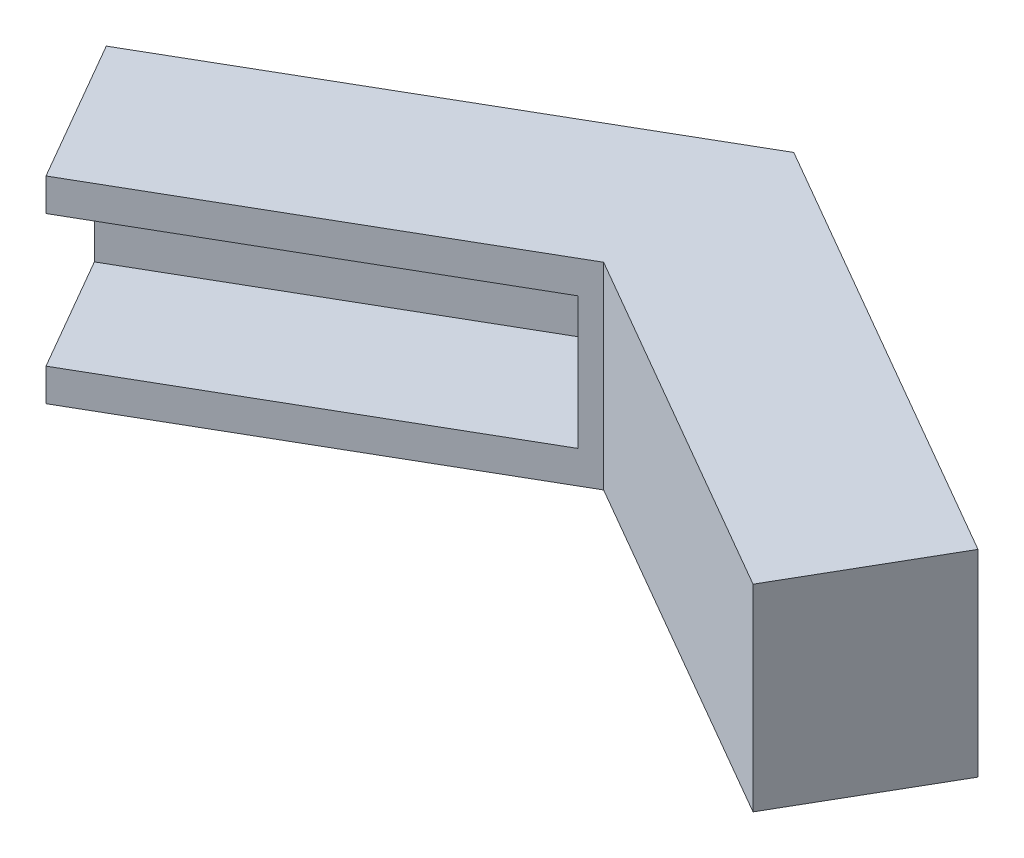
ISO-10303-21;
HEADER;
FILE_DESCRIPTION(('STEP AP214'),'2;1');
FILE_NAME('part.step','',(''),(''),'','','');
FILE_SCHEMA(('AUTOMOTIVE_DESIGN { 1 0 10303 214 1 1 1 1 }'));
ENDSEC;
DATA;
#1=APPLICATION_CONTEXT('core data for automotive mechanical design processes');
#2=APPLICATION_PROTOCOL_DEFINITION('international standard','automotive_design',2000,#1);
#3=PRODUCT_CONTEXT('',#1,'mechanical');
#4=PRODUCT('Part','Part','',(#3));
#5=PRODUCT_RELATED_PRODUCT_CATEGORY('part','',(#4));
#6=PRODUCT_DEFINITION_FORMATION('','',#4);
#7=PRODUCT_DEFINITION_CONTEXT('part definition',#1,'design');
#8=PRODUCT_DEFINITION('design','',#6,#7);
#9=PRODUCT_DEFINITION_SHAPE('','',#8);
#10=(LENGTH_UNIT() NAMED_UNIT(*) SI_UNIT(.MILLI.,.METRE.));
#11=(NAMED_UNIT(*) PLANE_ANGLE_UNIT() SI_UNIT($,.RADIAN.));
#12=(NAMED_UNIT(*) SI_UNIT($,.STERADIAN.) SOLID_ANGLE_UNIT());
#13=UNCERTAINTY_MEASURE_WITH_UNIT(LENGTH_MEASURE(1.E-05),#10,'distance_accuracy_value','');
#14=(GEOMETRIC_REPRESENTATION_CONTEXT(3) GLOBAL_UNCERTAINTY_ASSIGNED_CONTEXT((#13)) GLOBAL_UNIT_ASSIGNED_CONTEXT((#10,
#11,#12)) REPRESENTATION_CONTEXT('',''));
#15=CARTESIAN_POINT('',(0.,0.,0.));
#16=DIRECTION('',(0.,0.,1.));
#17=DIRECTION('',(1.,0.,0.));
#18=AXIS2_PLACEMENT_3D('',#15,#16,#17);
#19=CARTESIAN_POINT('',(0.,30.3,-34.6446766825694));
#20=DIRECTION('',(0.5,0.,0.866025403784439));
#21=DIRECTION('',(0.866025403784439,0.,-0.5));
#22=AXIS2_PLACEMENT_3D('',#19,#20,#21);
#23=PLANE('',#22);
#24=DIRECTION('',(-0.866025403784439,0.,0.5));
#25=VECTOR('',#24,1.);
#26=CARTESIAN_POINT('',(0.,0.,-34.6446766825694));
#27=LINE('',#26,#25);
#28=CARTESIAN_POINT('',(0.,0.,-34.6446766825694));
#29=VERTEX_POINT('',#28);
#30=CARTESIAN_POINT('',(-66.9631092835681,0.,4.01649248807289));
#31=VERTEX_POINT('',#30);
#32=EDGE_CURVE('E129',#29,#31,#27,.T.);
#33=ORIENTED_EDGE('',*,*,#32,.T.);
#34=DIRECTION('',(0.,-1.,0.));
#35=VECTOR('',#34,1.);
#36=CARTESIAN_POINT('',(-66.9631092835681,30.3,4.01649248807289));
#37=LINE('',#36,#35);
#38=CARTESIAN_POINT('',(-66.9631092835681,30.3,4.01649248807289));
#39=VERTEX_POINT('',#38);
#40=EDGE_CURVE('E11',#39,#31,#37,.T.);
#41=ORIENTED_EDGE('',*,*,#40,.F.);
#42=DIRECTION('',(-0.866025403784439,0.,0.5));
#43=VECTOR('',#42,1.);
#44=CARTESIAN_POINT('',(0.,30.3,-34.6446766825694));
#45=LINE('',#44,#43);
#46=CARTESIAN_POINT('',(0.,30.3,-34.6446766825694));
#47=VERTEX_POINT('',#46);
#48=EDGE_CURVE('E142',#47,#39,#45,.T.);
#49=ORIENTED_EDGE('',*,*,#48,.F.);
#50=DIRECTION('',(0.,-1.,0.));
#51=VECTOR('',#50,1.);
#52=CARTESIAN_POINT('',(0.,30.3,-34.6446766825694));
#53=LINE('',#52,#51);
#54=EDGE_CURVE('E125',#47,#29,#53,.T.);
#55=ORIENTED_EDGE('',*,*,#54,.T.);
#56=EDGE_LOOP('',(#33,#41,#49,#55));
#57=FACE_BOUND('',#56,.T.);
#58=ADVANCED_FACE('F33',(#57),#23,.F.);
#59=CARTESIAN_POINT('',(-66.9631092835681,30.3,4.01649248807289));
#60=DIRECTION('',(0.866025403784439,0.,-0.5));
#61=DIRECTION('',(-0.5,0.,-0.866025403784439));
#62=AXIS2_PLACEMENT_3D('',#59,#60,#61);
#63=PLANE('',#62);
#64=DIRECTION('',(0.,-1.,0.));
#65=VECTOR('',#64,1.);
#66=CARTESIAN_POINT('',(-64.4631092835681,25.3,8.3466195069951));
#67=LINE('',#66,#65);
#68=CARTESIAN_POINT('',(-64.4631092835681,25.3,8.3466195069951));
#69=VERTEX_POINT('',#68);
#70=CARTESIAN_POINT('',(-64.4631092835681,5.,8.34661950699509));
#71=VERTEX_POINT('',#70);
#72=EDGE_CURVE('E179',#69,#71,#67,.T.);
#73=ORIENTED_EDGE('',*,*,#72,.F.);
#74=DIRECTION('',(0.5,0.,0.866025403784438));
#75=VECTOR('',#74,1.);
#76=CARTESIAN_POINT('',(-64.4631092835681,25.3,8.3466195069951));
#77=LINE('',#76,#75);
#78=CARTESIAN_POINT('',(-54.3131092835681,25.3,25.9269352038192));
#79=VERTEX_POINT('',#78);
#80=EDGE_CURVE('E133',#69,#79,#77,.T.);
#81=ORIENTED_EDGE('',*,*,#80,.T.);
#82=DIRECTION('',(0.,-1.,0.));
#83=VECTOR('',#82,1.);
#84=CARTESIAN_POINT('',(-54.3131092835681,30.3,25.9269352038192));
#85=LINE('',#84,#83);
#86=CARTESIAN_POINT('',(-54.3131092835681,30.3,25.9269352038192));
#87=VERTEX_POINT('',#86);
#88=EDGE_CURVE('E40',#87,#79,#85,.T.);
#89=ORIENTED_EDGE('',*,*,#88,.F.);
#90=DIRECTION('',(0.5,0.,0.866025403784439));
#91=VECTOR('',#90,1.);
#92=CARTESIAN_POINT('',(-66.9631092835681,30.3,4.01649248807289));
#93=LINE('',#92,#91);
#94=EDGE_CURVE('E91',#39,#87,#93,.T.);
#95=ORIENTED_EDGE('',*,*,#94,.F.);
#96=ORIENTED_EDGE('',*,*,#40,.T.);
#97=DIRECTION('',(0.5,0.,0.866025403784439));
#98=VECTOR('',#97,1.);
#99=CARTESIAN_POINT('',(-66.9631092835681,0.,4.01649248807289));
#100=LINE('',#99,#98);
#101=CARTESIAN_POINT('',(-54.3131092835681,0.,25.9269352038192));
#102=VERTEX_POINT('',#101);
#103=EDGE_CURVE('E132',#31,#102,#100,.T.);
#104=ORIENTED_EDGE('',*,*,#103,.T.);
#105=CARTESIAN_POINT('',(-54.3131092835681,5.00000000000001,25.9269352038192));
#106=VERTEX_POINT('',#105);
#107=EDGE_CURVE('E145',#106,#102,#85,.T.);
#108=ORIENTED_EDGE('',*,*,#107,.F.);
#109=DIRECTION('',(0.5,0.,0.866025403784438));
#110=VECTOR('',#109,1.);
#111=CARTESIAN_POINT('',(-64.4631092835681,5.,8.34661950699509));
#112=LINE('',#111,#110);
#113=EDGE_CURVE('E47',#71,#106,#112,.T.);
#114=ORIENTED_EDGE('',*,*,#113,.F.);
#115=EDGE_LOOP('',(#73,#81,#89,#95,#96,#104,#108,#114));
#116=FACE_BOUND('',#115,.T.);
#117=ADVANCED_FACE('F155',(#116),#63,.F.);
#118=CARTESIAN_POINT('',(-54.3131092835681,30.3,25.9269352038192));
#119=DIRECTION('',(-0.5,0.,-0.866025403784439));
#120=DIRECTION('',(-0.866025403784439,0.,0.5));
#121=AXIS2_PLACEMENT_3D('',#118,#119,#120);
#122=PLANE('',#121);
#123=ORIENTED_EDGE('',*,*,#88,.T.);
#124=DIRECTION('',(-0.866025403784438,0.,0.5));
#125=VECTOR('',#124,1.);
#126=CARTESIAN_POINT('',(-2.50000000000001,25.3,-3.98737738860035));
#127=LINE('',#126,#125);
#128=CARTESIAN_POINT('',(-2.50000000000001,25.3,-3.98737738860035));
#129=VERTEX_POINT('',#128);
#130=EDGE_CURVE('E176',#129,#79,#127,.T.);
#131=ORIENTED_EDGE('',*,*,#130,.F.);
#132=DIRECTION('',(0.,1.,0.));
#133=VECTOR('',#132,1.);
#134=CARTESIAN_POINT('',(-2.50000000000001,25.3,-3.98737738860035));
#135=LINE('',#134,#133);
#136=CARTESIAN_POINT('',(-2.50000000000001,5.,-3.98737738860035));
#137=VERTEX_POINT('',#136);
#138=EDGE_CURVE('E180',#137,#129,#135,.T.);
#139=ORIENTED_EDGE('',*,*,#138,.F.);
#140=DIRECTION('',(0.866025403784438,0.,-0.5));
#141=VECTOR('',#140,1.);
#142=CARTESIAN_POINT('',(-2.50000000000001,5.,-3.98737738860035));
#143=LINE('',#142,#141);
#144=EDGE_CURVE('E153',#106,#137,#143,.T.);
#145=ORIENTED_EDGE('',*,*,#144,.F.);
#146=ORIENTED_EDGE('',*,*,#107,.T.);
#147=DIRECTION('',(0.866025403784438,0.,-0.5));
#148=VECTOR('',#147,1.);
#149=CARTESIAN_POINT('',(-54.3131092835681,0.,25.9269352038192));
#150=LINE('',#149,#148);
#151=CARTESIAN_POINT('',(0.,0.,-5.43075306157441));
#152=VERTEX_POINT('',#151);
#153=EDGE_CURVE('E136',#102,#152,#150,.T.);
#154=ORIENTED_EDGE('',*,*,#153,.T.);
#155=DIRECTION('',(0.,-1.,0.));
#156=VECTOR('',#155,1.);
#157=CARTESIAN_POINT('',(0.,30.3,-5.43075306157441));
#158=LINE('',#157,#156);
#159=CARTESIAN_POINT('',(0.,30.3,-5.43075306157441));
#160=VERTEX_POINT('',#159);
#161=EDGE_CURVE('E120',#160,#152,#158,.T.);
#162=ORIENTED_EDGE('',*,*,#161,.F.);
#163=DIRECTION('',(0.866025403784438,0.,-0.5));
#164=VECTOR('',#163,1.);
#165=CARTESIAN_POINT('',(-54.3131092835681,30.3,25.9269352038192));
#166=LINE('',#165,#164);
#167=EDGE_CURVE('E108',#87,#160,#166,.T.);
#168=ORIENTED_EDGE('',*,*,#167,.F.);
#169=EDGE_LOOP('',(#123,#131,#139,#145,#146,#154,#162,#168));
#170=FACE_BOUND('',#169,.T.);
#171=ADVANCED_FACE('F150',(#170),#122,.F.);
#172=CARTESIAN_POINT('',(0.,30.3,-5.43075306157441));
#173=DIRECTION('',(0.5,0.,-0.866025403784439));
#174=DIRECTION('',(-0.866025403784439,0.,-0.5));
#175=AXIS2_PLACEMENT_3D('',#172,#173,#174);
#176=PLANE('',#175);
#177=DIRECTION('',(0.866025403784439,0.,0.5));
#178=VECTOR('',#177,1.);
#179=CARTESIAN_POINT('',(0.,0.,-5.43075306157441));
#180=LINE('',#179,#178);
#181=CARTESIAN_POINT('',(54.3131092835681,0.,25.9269352038192));
#182=VERTEX_POINT('',#181);
#183=EDGE_CURVE('E117',#152,#182,#180,.T.);
#184=ORIENTED_EDGE('',*,*,#183,.T.);
#185=DIRECTION('',(0.,-1.,0.));
#186=VECTOR('',#185,1.);
#187=CARTESIAN_POINT('',(54.3131092835681,30.3,25.9269352038192));
#188=LINE('',#187,#186);
#189=CARTESIAN_POINT('',(54.3131092835681,30.3,25.9269352038192));
#190=VERTEX_POINT('',#189);
#191=EDGE_CURVE('E114',#190,#182,#188,.T.);
#192=ORIENTED_EDGE('',*,*,#191,.F.);
#193=DIRECTION('',(0.866025403784439,0.,0.5));
#194=VECTOR('',#193,1.);
#195=CARTESIAN_POINT('',(0.,30.3,-5.43075306157441));
#196=LINE('',#195,#194);
#197=EDGE_CURVE('E101',#160,#190,#196,.T.);
#198=ORIENTED_EDGE('',*,*,#197,.F.);
#199=ORIENTED_EDGE('',*,*,#161,.T.);
#200=EDGE_LOOP('',(#184,#192,#198,#199));
#201=FACE_BOUND('',#200,.T.);
#202=ADVANCED_FACE('F115',(#201),#176,.F.);
#203=CARTESIAN_POINT('',(54.3131092835681,30.3,25.9269352038192));
#204=DIRECTION('',(-0.866025403784439,0.,-0.499999999999999));
#205=DIRECTION('',(-0.499999999999999,0.,0.866025403784439));
#206=AXIS2_PLACEMENT_3D('',#203,#204,#205);
#207=PLANE('',#206);
#208=DIRECTION('',(0.499999999999999,0.,-0.866025403784439));
#209=VECTOR('',#208,1.);
#210=CARTESIAN_POINT('',(54.3131092835681,0.,25.9269352038192));
#211=LINE('',#210,#209);
#212=CARTESIAN_POINT('',(66.9631092835681,0.,4.01649248807288));
#213=VERTEX_POINT('',#212);
#214=EDGE_CURVE('E139',#182,#213,#211,.T.);
#215=ORIENTED_EDGE('',*,*,#214,.T.);
#216=DIRECTION('',(0.,-1.,0.));
#217=VECTOR('',#216,1.);
#218=CARTESIAN_POINT('',(66.9631092835681,30.3,4.01649248807288));
#219=LINE('',#218,#217);
#220=CARTESIAN_POINT('',(66.9631092835681,30.3,4.01649248807288));
#221=VERTEX_POINT('',#220);
#222=EDGE_CURVE('E121',#221,#213,#219,.T.);
#223=ORIENTED_EDGE('',*,*,#222,.F.);
#224=DIRECTION('',(0.499999999999999,0.,-0.866025403784439));
#225=VECTOR('',#224,1.);
#226=CARTESIAN_POINT('',(54.3131092835681,30.3,25.9269352038192));
#227=LINE('',#226,#225);
#228=EDGE_CURVE('E105',#190,#221,#227,.T.);
#229=ORIENTED_EDGE('',*,*,#228,.F.);
#230=ORIENTED_EDGE('',*,*,#191,.T.);
#231=EDGE_LOOP('',(#215,#223,#229,#230));
#232=FACE_BOUND('',#231,.T.);
#233=ADVANCED_FACE('F123',(#232),#207,.F.);
#234=CARTESIAN_POINT('',(66.9631092835681,30.3,4.01649248807288));
#235=DIRECTION('',(-0.5,0.,0.866025403784439));
#236=DIRECTION('',(0.866025403784439,0.,0.5));
#237=AXIS2_PLACEMENT_3D('',#234,#235,#236);
#238=PLANE('',#237);
#239=DIRECTION('',(-0.866025403784439,0.,-0.5));
#240=VECTOR('',#239,1.);
#241=CARTESIAN_POINT('',(66.9631092835681,0.,4.01649248807288));
#242=LINE('',#241,#240);
#243=EDGE_CURVE('E83',#213,#29,#242,.T.);
#244=ORIENTED_EDGE('',*,*,#243,.T.);
#245=ORIENTED_EDGE('',*,*,#54,.F.);
#246=DIRECTION('',(-0.866025403784439,0.,-0.5));
#247=VECTOR('',#246,1.);
#248=CARTESIAN_POINT('',(66.9631092835681,30.3,4.01649248807288));
#249=LINE('',#248,#247);
#250=EDGE_CURVE('E56',#221,#47,#249,.T.);
#251=ORIENTED_EDGE('',*,*,#250,.F.);
#252=ORIENTED_EDGE('',*,*,#222,.T.);
#253=EDGE_LOOP('',(#244,#245,#251,#252));
#254=FACE_BOUND('',#253,.T.);
#255=ADVANCED_FACE('F160',(#254),#238,.F.);
#256=CARTESIAN_POINT('',(0.,30.3,0.));
#257=DIRECTION('',(0.,1.,0.));
#258=DIRECTION('',(0.,0.,1.));
#259=AXIS2_PLACEMENT_3D('',#256,#257,#258);
#260=PLANE('',#259);
#261=ORIENTED_EDGE('',*,*,#48,.T.);
#262=ORIENTED_EDGE('',*,*,#94,.T.);
#263=ORIENTED_EDGE('',*,*,#167,.T.);
#264=ORIENTED_EDGE('',*,*,#197,.T.);
#265=ORIENTED_EDGE('',*,*,#228,.T.);
#266=ORIENTED_EDGE('',*,*,#250,.T.);
#267=EDGE_LOOP('',(#261,#262,#263,#264,#265,#266));
#268=FACE_BOUND('',#267,.T.);
#269=ADVANCED_FACE('F103',(#268),#260,.T.);
#270=CARTESIAN_POINT('',(0.,0.,0.));
#271=DIRECTION('',(0.,1.,0.));
#272=DIRECTION('',(0.,0.,1.));
#273=AXIS2_PLACEMENT_3D('',#270,#271,#272);
#274=PLANE('',#273);
#275=ORIENTED_EDGE('',*,*,#32,.F.);
#276=ORIENTED_EDGE('',*,*,#243,.F.);
#277=ORIENTED_EDGE('',*,*,#214,.F.);
#278=ORIENTED_EDGE('',*,*,#183,.F.);
#279=ORIENTED_EDGE('',*,*,#153,.F.);
#280=ORIENTED_EDGE('',*,*,#103,.F.);
#281=EDGE_LOOP('',(#275,#276,#277,#278,#279,#280));
#282=FACE_BOUND('',#281,.T.);
#283=ADVANCED_FACE('F159',(#282),#274,.F.);
#284=CARTESIAN_POINT('',(-12.65,25.3,-21.5676930854245));
#285=DIRECTION('',(0.,1.,0.));
#286=DIRECTION('',(-1.,0.,0.));
#287=AXIS2_PLACEMENT_3D('',#284,#285,#286);
#288=PLANE('',#287);
#289=ORIENTED_EDGE('',*,*,#130,.T.);
#290=ORIENTED_EDGE('',*,*,#80,.F.);
#291=DIRECTION('',(-0.866025403784438,0.,0.5));
#292=VECTOR('',#291,1.);
#293=CARTESIAN_POINT('',(-12.65,25.3,-21.5676930854245));
#294=LINE('',#293,#292);
#295=CARTESIAN_POINT('',(-12.65,25.3,-21.5676930854245));
#296=VERTEX_POINT('',#295);
#297=EDGE_CURVE('E168',#296,#69,#294,.T.);
#298=ORIENTED_EDGE('',*,*,#297,.F.);
#299=DIRECTION('',(0.5,0.,0.866025403784438));
#300=VECTOR('',#299,1.);
#301=CARTESIAN_POINT('',(-12.65,25.3,-21.5676930854245));
#302=LINE('',#301,#300);
#303=EDGE_CURVE('E171',#296,#129,#302,.T.);
#304=ORIENTED_EDGE('',*,*,#303,.T.);
#305=EDGE_LOOP('',(#289,#290,#298,#304));
#306=FACE_BOUND('',#305,.T.);
#307=ADVANCED_FACE('F209',(#306),#288,.F.);
#308=CARTESIAN_POINT('',(-12.65,25.3,-21.5676930854245));
#309=DIRECTION('',(0.866025403784438,0.,-0.5));
#310=DIRECTION('',(-0.5,0.,-0.866025403784439));
#311=AXIS2_PLACEMENT_3D('',#308,#309,#310);
#312=PLANE('',#311);
#313=ORIENTED_EDGE('',*,*,#138,.T.);
#314=ORIENTED_EDGE('',*,*,#303,.F.);
#315=DIRECTION('',(0.,1.,0.));
#316=VECTOR('',#315,1.);
#317=CARTESIAN_POINT('',(-12.65,25.3,-21.5676930854245));
#318=LINE('',#317,#316);
#319=CARTESIAN_POINT('',(-12.65,5.,-21.5676930854245));
#320=VERTEX_POINT('',#319);
#321=EDGE_CURVE('E186',#320,#296,#318,.T.);
#322=ORIENTED_EDGE('',*,*,#321,.F.);
#323=DIRECTION('',(0.5,0.,0.866025403784438));
#324=VECTOR('',#323,1.);
#325=CARTESIAN_POINT('',(-12.65,5.,-21.5676930854245));
#326=LINE('',#325,#324);
#327=EDGE_CURVE('E167',#320,#137,#326,.T.);
#328=ORIENTED_EDGE('',*,*,#327,.T.);
#329=EDGE_LOOP('',(#313,#314,#322,#328));
#330=FACE_BOUND('',#329,.T.);
#331=ADVANCED_FACE('F211',(#330),#312,.F.);
#332=CARTESIAN_POINT('',(-12.65,5.,-21.5676930854245));
#333=DIRECTION('',(0.,-1.,0.));
#334=DIRECTION('',(0.,0.,-1.));
#335=AXIS2_PLACEMENT_3D('',#332,#333,#334);
#336=PLANE('',#335);
#337=ORIENTED_EDGE('',*,*,#144,.T.);
#338=ORIENTED_EDGE('',*,*,#327,.F.);
#339=DIRECTION('',(0.866025403784438,0.,-0.5));
#340=VECTOR('',#339,1.);
#341=CARTESIAN_POINT('',(-12.65,5.,-21.5676930854245));
#342=LINE('',#341,#340);
#343=EDGE_CURVE('E189',#71,#320,#342,.T.);
#344=ORIENTED_EDGE('',*,*,#343,.F.);
#345=ORIENTED_EDGE('',*,*,#113,.T.);
#346=EDGE_LOOP('',(#337,#338,#344,#345));
#347=FACE_BOUND('',#346,.T.);
#348=ADVANCED_FACE('F214',(#347),#336,.F.);
#349=CARTESIAN_POINT('',(-12.5015850565018,0.,-21.6533804930049));
#350=DIRECTION('',(-0.5,0.,-0.866025403784439));
#351=DIRECTION('',(-0.866025403784438,0.,0.5));
#352=AXIS2_PLACEMENT_3D('',#349,#350,#351);
#353=PLANE('',#352);
#354=ORIENTED_EDGE('',*,*,#72,.T.);
#355=ORIENTED_EDGE('',*,*,#343,.T.);
#356=ORIENTED_EDGE('',*,*,#321,.T.);
#357=ORIENTED_EDGE('',*,*,#297,.T.);
#358=EDGE_LOOP('',(#354,#355,#356,#357));
#359=FACE_BOUND('',#358,.T.);
#360=ADVANCED_FACE('F195',(#359),#353,.F.);
#361=CLOSED_SHELL('',(#58,#117,#171,#202,#233,#255,#269,#283,#307,#331,#348,#360));
#362=MANIFOLD_SOLID_BREP('B2',#361);
#363=ADVANCED_BREP_SHAPE_REPRESENTATION('',(#18,#362),#14);
#364=SHAPE_DEFINITION_REPRESENTATION(#9,#363);
ENDSEC;
END-ISO-10303-21;
